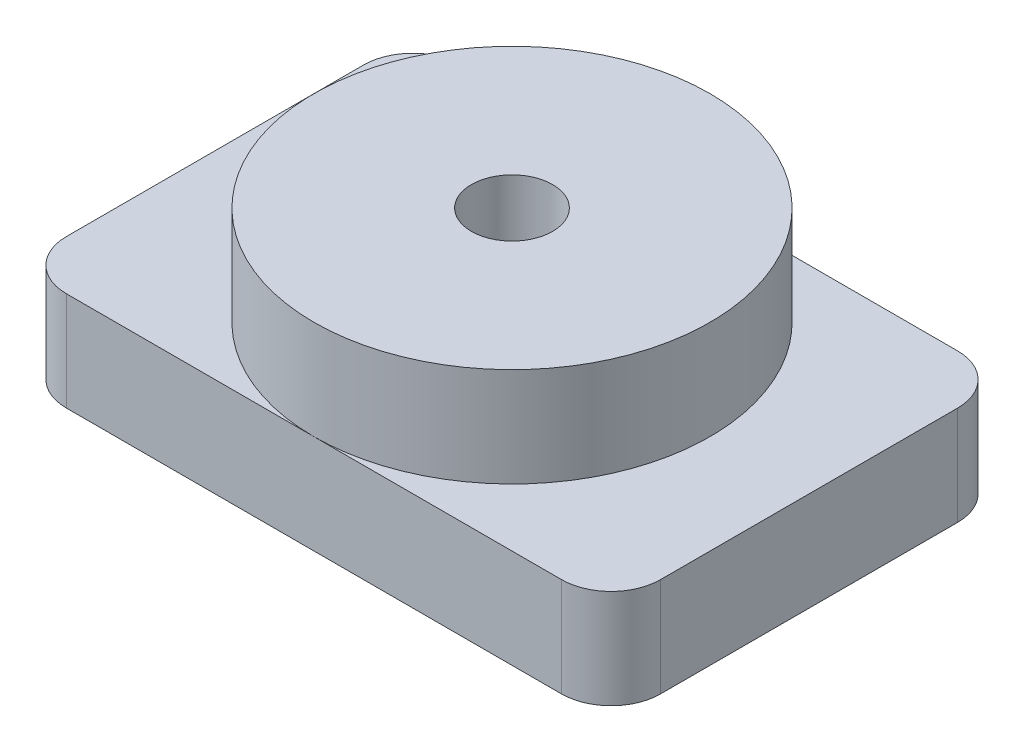
ISO-10303-21;
HEADER;
FILE_DESCRIPTION(('STEP AP214'),'2;1');
FILE_NAME('part.step','',(''),(''),'','','');
FILE_SCHEMA(('AUTOMOTIVE_DESIGN { 1 0 10303 214 1 1 1 1 }'));
ENDSEC;
DATA;
#1=APPLICATION_CONTEXT('core data for automotive mechanical design processes');
#2=APPLICATION_PROTOCOL_DEFINITION('international standard','automotive_design',2000,#1);
#3=PRODUCT_CONTEXT('',#1,'mechanical');
#4=PRODUCT('Part','Part','',(#3));
#5=PRODUCT_RELATED_PRODUCT_CATEGORY('part','',(#4));
#6=PRODUCT_DEFINITION_FORMATION('','',#4);
#7=PRODUCT_DEFINITION_CONTEXT('part definition',#1,'design');
#8=PRODUCT_DEFINITION('design','',#6,#7);
#9=PRODUCT_DEFINITION_SHAPE('','',#8);
#10=(LENGTH_UNIT() NAMED_UNIT(*) SI_UNIT(.MILLI.,.METRE.));
#11=(NAMED_UNIT(*) PLANE_ANGLE_UNIT() SI_UNIT($,.RADIAN.));
#12=(NAMED_UNIT(*) SI_UNIT($,.STERADIAN.) SOLID_ANGLE_UNIT());
#13=UNCERTAINTY_MEASURE_WITH_UNIT(LENGTH_MEASURE(1.E-05),#10,'distance_accuracy_value','');
#14=(GEOMETRIC_REPRESENTATION_CONTEXT(3) GLOBAL_UNCERTAINTY_ASSIGNED_CONTEXT((#13)) GLOBAL_UNIT_ASSIGNED_CONTEXT((#10,
#11,#12)) REPRESENTATION_CONTEXT('',''));
#15=CARTESIAN_POINT('',(0.,0.,0.));
#16=DIRECTION('',(0.,0.,1.));
#17=DIRECTION('',(1.,0.,0.));
#18=AXIS2_PLACEMENT_3D('',#15,#16,#17);
#19=CARTESIAN_POINT('',(0.,0.,0.));
#20=DIRECTION('',(0.,1.,0.));
#21=DIRECTION('',(0.,0.,1.));
#22=AXIS2_PLACEMENT_3D('',#19,#20,#21);
#23=CYLINDRICAL_SURFACE('',#22,4.1);
#24=CARTESIAN_POINT('',(0.,20.,0.));
#25=DIRECTION('',(0.,1.,0.));
#26=DIRECTION('',(0.,0.,1.));
#27=AXIS2_PLACEMENT_3D('',#24,#25,#26);
#28=CIRCLE('',#27,4.1);
#29=CARTESIAN_POINT('',(0.,20.,4.1));
#30=VERTEX_POINT('',#29);
#31=EDGE_CURVE('E197',#30,#30,#28,.T.);
#32=ORIENTED_EDGE('',*,*,#31,.T.);
#33=EDGE_LOOP('',(#32));
#34=FACE_BOUND('',#33,.T.);
#35=CARTESIAN_POINT('',(0.,7.,0.));
#36=DIRECTION('',(0.,-1.,0.));
#37=DIRECTION('',(0.,0.,-1.));
#38=AXIS2_PLACEMENT_3D('',#35,#36,#37);
#39=CIRCLE('',#38,4.1);
#40=CARTESIAN_POINT('',(0.,7.,-4.1));
#41=VERTEX_POINT('',#40);
#42=EDGE_CURVE('E37',#41,#41,#39,.F.);
#43=ORIENTED_EDGE('',*,*,#42,.F.);
#44=EDGE_LOOP('',(#43));
#45=FACE_BOUND('',#44,.T.);
#46=ADVANCED_FACE('F33',(#34,#45),#23,.F.);
#47=CARTESIAN_POINT('',(0.,10.,0.));
#48=DIRECTION('',(0.,-1.,0.));
#49=DIRECTION('',(0.,0.,-1.));
#50=AXIS2_PLACEMENT_3D('',#47,#48,#49);
#51=PLANE('',#50);
#52=DIRECTION('',(0.,0.,-1.));
#53=VECTOR('',#52,1.);
#54=CARTESIAN_POINT('',(30.,10.,-20.));
#55=LINE('',#54,#53);
#56=CARTESIAN_POINT('',(30.,10.,15.));
#57=VERTEX_POINT('',#56);
#58=CARTESIAN_POINT('',(30.,10.,-15.));
#59=VERTEX_POINT('',#58);
#60=EDGE_CURVE('E215',#57,#59,#55,.T.);
#61=ORIENTED_EDGE('',*,*,#60,.T.);
#62=CARTESIAN_POINT('',(25.,10.,-15.));
#63=DIRECTION('',(0.,-1.,0.));
#64=DIRECTION('',(0.,0.,-1.));
#65=AXIS2_PLACEMENT_3D('',#62,#63,#64);
#66=CIRCLE('',#65,5.);
#67=CARTESIAN_POINT('',(25.,10.,-20.));
#68=VERTEX_POINT('',#67);
#69=EDGE_CURVE('E11',#59,#68,#66,.F.);
#70=ORIENTED_EDGE('',*,*,#69,.T.);
#71=DIRECTION('',(-1.,0.,0.));
#72=VECTOR('',#71,1.);
#73=CARTESIAN_POINT('',(30.,10.,-20.));
#74=LINE('',#73,#72);
#75=CARTESIAN_POINT('',(0.,10.,-20.));
#76=VERTEX_POINT('',#75);
#77=EDGE_CURVE('E218',#68,#76,#74,.T.);
#78=ORIENTED_EDGE('',*,*,#77,.T.);
#79=CARTESIAN_POINT('',(0.,10.,0.));
#80=DIRECTION('',(0.,1.,0.));
#81=DIRECTION('',(0.,0.,1.));
#82=AXIS2_PLACEMENT_3D('',#79,#80,#81);
#83=CIRCLE('',#82,20.);
#84=CARTESIAN_POINT('',(0.,10.,20.));
#85=VERTEX_POINT('',#84);
#86=EDGE_CURVE('E200',#85,#76,#83,.T.);
#87=ORIENTED_EDGE('',*,*,#86,.F.);
#88=DIRECTION('',(1.,0.,0.));
#89=VECTOR('',#88,1.);
#90=CARTESIAN_POINT('',(30.,10.,20.));
#91=LINE('',#90,#89);
#92=CARTESIAN_POINT('',(25.,10.,20.));
#93=VERTEX_POINT('',#92);
#94=EDGE_CURVE('E211',#85,#93,#91,.T.);
#95=ORIENTED_EDGE('',*,*,#94,.T.);
#96=CARTESIAN_POINT('',(25.,10.,15.));
#97=DIRECTION('',(0.,-1.,0.));
#98=DIRECTION('',(0.,0.,-1.));
#99=AXIS2_PLACEMENT_3D('',#96,#97,#98);
#100=CIRCLE('',#99,5.);
#101=EDGE_CURVE('E42',#93,#57,#100,.F.);
#102=ORIENTED_EDGE('',*,*,#101,.T.);
#103=EDGE_LOOP('',(#61,#70,#78,#87,#95,#102));
#104=FACE_BOUND('',#103,.T.);
#105=ADVANCED_FACE('F263',(#104),#51,.F.);
#106=CARTESIAN_POINT('',(-30.,10.,-20.));
#107=DIRECTION('',(1.,0.,0.));
#108=DIRECTION('',(0.,0.,-1.));
#109=AXIS2_PLACEMENT_3D('',#106,#107,#108);
#110=PLANE('',#109);
#111=DIRECTION('',(0.,0.,1.));
#112=VECTOR('',#111,1.);
#113=CARTESIAN_POINT('',(-30.,0.,-20.));
#114=LINE('',#113,#112);
#115=CARTESIAN_POINT('',(-30.,0.,-15.));
#116=VERTEX_POINT('',#115);
#117=CARTESIAN_POINT('',(-30.,0.,15.));
#118=VERTEX_POINT('',#117);
#119=EDGE_CURVE('E204',#116,#118,#114,.T.);
#120=ORIENTED_EDGE('',*,*,#119,.T.);
#121=DIRECTION('',(0.,-1.,0.));
#122=VECTOR('',#121,1.);
#123=CARTESIAN_POINT('',(-30.,10.,15.));
#124=LINE('',#123,#122);
#125=CARTESIAN_POINT('',(-30.,10.,15.));
#126=VERTEX_POINT('',#125);
#127=EDGE_CURVE('E245',#118,#126,#124,.F.);
#128=ORIENTED_EDGE('',*,*,#127,.T.);
#129=DIRECTION('',(0.,0.,1.));
#130=VECTOR('',#129,1.);
#131=CARTESIAN_POINT('',(-30.,10.,-20.));
#132=LINE('',#131,#130);
#133=CARTESIAN_POINT('',(-30.,10.,-15.));
#134=VERTEX_POINT('',#133);
#135=EDGE_CURVE('E208',#134,#126,#132,.T.);
#136=ORIENTED_EDGE('',*,*,#135,.F.);
#137=DIRECTION('',(0.,-1.,0.));
#138=VECTOR('',#137,1.);
#139=CARTESIAN_POINT('',(-30.,10.,-15.));
#140=LINE('',#139,#138);
#141=EDGE_CURVE('E242',#134,#116,#140,.T.);
#142=ORIENTED_EDGE('',*,*,#141,.T.);
#143=EDGE_LOOP('',(#120,#128,#136,#142));
#144=FACE_BOUND('',#143,.T.);
#145=ADVANCED_FACE('F285',(#144),#110,.F.);
#146=CARTESIAN_POINT('',(30.,10.,20.));
#147=DIRECTION('',(0.,0.,-1.));
#148=DIRECTION('',(-1.,0.,0.));
#149=AXIS2_PLACEMENT_3D('',#146,#147,#148);
#150=PLANE('',#149);
#151=CARTESIAN_POINT('',(-25.,10.,20.));
#152=VERTEX_POINT('',#151);
#153=EDGE_CURVE('E213',#152,#85,#91,.T.);
#154=ORIENTED_EDGE('',*,*,#153,.F.);
#155=DIRECTION('',(0.,-1.,0.));
#156=VECTOR('',#155,1.);
#157=CARTESIAN_POINT('',(-25.,10.,20.));
#158=LINE('',#157,#156);
#159=CARTESIAN_POINT('',(-25.,0.,20.));
#160=VERTEX_POINT('',#159);
#161=EDGE_CURVE('E231',#152,#160,#158,.T.);
#162=ORIENTED_EDGE('',*,*,#161,.T.);
#163=DIRECTION('',(1.,0.,0.));
#164=VECTOR('',#163,1.);
#165=CARTESIAN_POINT('',(30.,0.,20.));
#166=LINE('',#165,#164);
#167=CARTESIAN_POINT('',(25.,0.,20.));
#168=VERTEX_POINT('',#167);
#169=EDGE_CURVE('E222',#160,#168,#166,.T.);
#170=ORIENTED_EDGE('',*,*,#169,.T.);
#171=DIRECTION('',(0.,-1.,0.));
#172=VECTOR('',#171,1.);
#173=CARTESIAN_POINT('',(25.,10.,20.));
#174=LINE('',#173,#172);
#175=EDGE_CURVE('E229',#168,#93,#174,.F.);
#176=ORIENTED_EDGE('',*,*,#175,.T.);
#177=ORIENTED_EDGE('',*,*,#94,.F.);
#178=EDGE_LOOP('',(#154,#162,#170,#176,#177));
#179=FACE_BOUND('',#178,.T.);
#180=ADVANCED_FACE('F277',(#179),#150,.F.);
#181=CARTESIAN_POINT('',(30.,10.,-20.));
#182=DIRECTION('',(-1.,0.,0.));
#183=DIRECTION('',(0.,0.,1.));
#184=AXIS2_PLACEMENT_3D('',#181,#182,#183);
#185=PLANE('',#184);
#186=DIRECTION('',(0.,0.,-1.));
#187=VECTOR('',#186,1.);
#188=CARTESIAN_POINT('',(30.,0.,-20.));
#189=LINE('',#188,#187);
#190=CARTESIAN_POINT('',(30.,0.,15.));
#191=VERTEX_POINT('',#190);
#192=CARTESIAN_POINT('',(30.,0.,-15.));
#193=VERTEX_POINT('',#192);
#194=EDGE_CURVE('E225',#191,#193,#189,.T.);
#195=ORIENTED_EDGE('',*,*,#194,.T.);
#196=DIRECTION('',(0.,-1.,0.));
#197=VECTOR('',#196,1.);
#198=CARTESIAN_POINT('',(30.,10.,-15.));
#199=LINE('',#198,#197);
#200=EDGE_CURVE('E57',#193,#59,#199,.F.);
#201=ORIENTED_EDGE('',*,*,#200,.T.);
#202=ORIENTED_EDGE('',*,*,#60,.F.);
#203=DIRECTION('',(0.,-1.,0.));
#204=VECTOR('',#203,1.);
#205=CARTESIAN_POINT('',(30.,10.,15.));
#206=LINE('',#205,#204);
#207=EDGE_CURVE('E256',#57,#191,#206,.T.);
#208=ORIENTED_EDGE('',*,*,#207,.T.);
#209=EDGE_LOOP('',(#195,#201,#202,#208));
#210=FACE_BOUND('',#209,.T.);
#211=ADVANCED_FACE('F270',(#210),#185,.F.);
#212=CARTESIAN_POINT('',(30.,10.,-20.));
#213=DIRECTION('',(0.,0.,1.));
#214=DIRECTION('',(1.,0.,0.));
#215=AXIS2_PLACEMENT_3D('',#212,#213,#214);
#216=PLANE('',#215);
#217=DIRECTION('',(-1.,0.,0.));
#218=VECTOR('',#217,1.);
#219=CARTESIAN_POINT('',(30.,0.,-20.));
#220=LINE('',#219,#218);
#221=CARTESIAN_POINT('',(25.,0.,-20.));
#222=VERTEX_POINT('',#221);
#223=CARTESIAN_POINT('',(-25.,0.,-20.));
#224=VERTEX_POINT('',#223);
#225=EDGE_CURVE('E212',#222,#224,#220,.T.);
#226=ORIENTED_EDGE('',*,*,#225,.T.);
#227=DIRECTION('',(0.,-1.,0.));
#228=VECTOR('',#227,1.);
#229=CARTESIAN_POINT('',(-25.,10.,-20.));
#230=LINE('',#229,#228);
#231=CARTESIAN_POINT('',(-25.,10.,-20.));
#232=VERTEX_POINT('',#231);
#233=EDGE_CURVE('E254',#224,#232,#230,.F.);
#234=ORIENTED_EDGE('',*,*,#233,.T.);
#235=EDGE_CURVE('E217',#76,#232,#74,.T.);
#236=ORIENTED_EDGE('',*,*,#235,.F.);
#237=ORIENTED_EDGE('',*,*,#77,.F.);
#238=DIRECTION('',(0.,-1.,0.));
#239=VECTOR('',#238,1.);
#240=CARTESIAN_POINT('',(25.,10.,-20.));
#241=LINE('',#240,#239);
#242=EDGE_CURVE('E251',#68,#222,#241,.T.);
#243=ORIENTED_EDGE('',*,*,#242,.T.);
#244=EDGE_LOOP('',(#226,#234,#236,#237,#243));
#245=FACE_BOUND('',#244,.T.);
#246=ADVANCED_FACE('F294',(#245),#216,.F.);
#247=ORIENTED_EDGE('',*,*,#135,.T.);
#248=CARTESIAN_POINT('',(-25.,10.,15.));
#249=DIRECTION('',(0.,-1.,0.));
#250=DIRECTION('',(0.,0.,-1.));
#251=AXIS2_PLACEMENT_3D('',#248,#249,#250);
#252=CIRCLE('',#251,5.);
#253=EDGE_CURVE('E249',#126,#152,#252,.F.);
#254=ORIENTED_EDGE('',*,*,#253,.T.);
#255=ORIENTED_EDGE('',*,*,#153,.T.);
#256=EDGE_CURVE('E207',#76,#85,#83,.T.);
#257=ORIENTED_EDGE('',*,*,#256,.F.);
#258=ORIENTED_EDGE('',*,*,#235,.T.);
#259=CARTESIAN_POINT('',(-25.,10.,-15.));
#260=DIRECTION('',(0.,-1.,0.));
#261=DIRECTION('',(0.,0.,-1.));
#262=AXIS2_PLACEMENT_3D('',#259,#260,#261);
#263=CIRCLE('',#262,5.);
#264=EDGE_CURVE('E247',#232,#134,#263,.F.);
#265=ORIENTED_EDGE('',*,*,#264,.T.);
#266=EDGE_LOOP('',(#247,#254,#255,#257,#258,#265));
#267=FACE_BOUND('',#266,.T.);
#268=ADVANCED_FACE('F304',(#267),#51,.F.);
#269=CARTESIAN_POINT('',(0.,0.,0.));
#270=DIRECTION('',(0.,-1.,0.));
#271=DIRECTION('',(0.,0.,-1.));
#272=AXIS2_PLACEMENT_3D('',#269,#270,#271);
#273=PLANE('',#272);
#274=DIRECTION('',(-0.5,0.,-0.866025403784439));
#275=VECTOR('',#274,1.);
#276=CARTESIAN_POINT('',(-3.83937929011101,0.,6.65));
#277=LINE('',#276,#275);
#278=CARTESIAN_POINT('',(-3.83937929011101,0.,6.65));
#279=VERTEX_POINT('',#278);
#280=CARTESIAN_POINT('',(-7.67875858022202,0.,0.));
#281=VERTEX_POINT('',#280);
#282=EDGE_CURVE('E49',#279,#281,#277,.T.);
#283=ORIENTED_EDGE('',*,*,#282,.F.);
#284=DIRECTION('',(-1.,0.,0.));
#285=VECTOR('',#284,1.);
#286=CARTESIAN_POINT('',(3.83937929011101,0.,6.65));
#287=LINE('',#286,#285);
#288=CARTESIAN_POINT('',(3.83937929011101,0.,6.65));
#289=VERTEX_POINT('',#288);
#290=EDGE_CURVE('E164',#289,#279,#287,.T.);
#291=ORIENTED_EDGE('',*,*,#290,.F.);
#292=DIRECTION('',(-0.5,0.,0.866025403784439));
#293=VECTOR('',#292,1.);
#294=CARTESIAN_POINT('',(7.67875858022202,0.,0.));
#295=LINE('',#294,#293);
#296=CARTESIAN_POINT('',(7.67875858022202,0.,0.));
#297=VERTEX_POINT('',#296);
#298=EDGE_CURVE('E167',#297,#289,#295,.T.);
#299=ORIENTED_EDGE('',*,*,#298,.F.);
#300=DIRECTION('',(0.5,0.,0.866025403784439));
#301=VECTOR('',#300,1.);
#302=CARTESIAN_POINT('',(3.83937929011101,0.,-6.65));
#303=LINE('',#302,#301);
#304=CARTESIAN_POINT('',(3.83937929011101,0.,-6.65));
#305=VERTEX_POINT('',#304);
#306=EDGE_CURVE('E183',#305,#297,#303,.T.);
#307=ORIENTED_EDGE('',*,*,#306,.F.);
#308=DIRECTION('',(1.,0.,0.));
#309=VECTOR('',#308,1.);
#310=CARTESIAN_POINT('',(-3.83937929011101,0.,-6.65));
#311=LINE('',#310,#309);
#312=CARTESIAN_POINT('',(-3.83937929011101,0.,-6.65));
#313=VERTEX_POINT('',#312);
#314=EDGE_CURVE('E180',#313,#305,#311,.T.);
#315=ORIENTED_EDGE('',*,*,#314,.F.);
#316=DIRECTION('',(0.5,0.,-0.866025403784438));
#317=VECTOR('',#316,1.);
#318=CARTESIAN_POINT('',(-7.67875858022202,0.,0.));
#319=LINE('',#318,#317);
#320=EDGE_CURVE('E178',#281,#313,#319,.T.);
#321=ORIENTED_EDGE('',*,*,#320,.F.);
#322=EDGE_LOOP('',(#283,#291,#299,#307,#315,#321));
#323=FACE_BOUND('',#322,.T.);
#324=ORIENTED_EDGE('',*,*,#169,.F.);
#325=CARTESIAN_POINT('',(-25.,0.,15.));
#326=DIRECTION('',(0.,-1.,0.));
#327=DIRECTION('',(0.,0.,-1.));
#328=AXIS2_PLACEMENT_3D('',#325,#326,#327);
#329=CIRCLE('',#328,5.);
#330=EDGE_CURVE('E240',#160,#118,#329,.T.);
#331=ORIENTED_EDGE('',*,*,#330,.T.);
#332=ORIENTED_EDGE('',*,*,#119,.F.);
#333=CARTESIAN_POINT('',(-25.,0.,-15.));
#334=DIRECTION('',(0.,-1.,0.));
#335=DIRECTION('',(0.,0.,-1.));
#336=AXIS2_PLACEMENT_3D('',#333,#334,#335);
#337=CIRCLE('',#336,5.);
#338=EDGE_CURVE('E238',#116,#224,#337,.T.);
#339=ORIENTED_EDGE('',*,*,#338,.T.);
#340=ORIENTED_EDGE('',*,*,#225,.F.);
#341=CARTESIAN_POINT('',(25.,0.,-15.));
#342=DIRECTION('',(0.,-1.,0.));
#343=DIRECTION('',(0.,0.,-1.));
#344=AXIS2_PLACEMENT_3D('',#341,#342,#343);
#345=CIRCLE('',#344,5.);
#346=EDGE_CURVE('E236',#222,#193,#345,.T.);
#347=ORIENTED_EDGE('',*,*,#346,.T.);
#348=ORIENTED_EDGE('',*,*,#194,.F.);
#349=CARTESIAN_POINT('',(25.,0.,15.));
#350=DIRECTION('',(0.,-1.,0.));
#351=DIRECTION('',(0.,0.,-1.));
#352=AXIS2_PLACEMENT_3D('',#349,#350,#351);
#353=CIRCLE('',#352,5.);
#354=EDGE_CURVE('E234',#191,#168,#353,.T.);
#355=ORIENTED_EDGE('',*,*,#354,.T.);
#356=EDGE_LOOP('',(#324,#331,#332,#339,#340,#347,#348,#355));
#357=FACE_BOUND('',#356,.T.);
#358=ADVANCED_FACE('F274',(#323,#357),#273,.T.);
#359=CARTESIAN_POINT('',(0.,20.,0.));
#360=DIRECTION('',(0.,-1.,0.));
#361=DIRECTION('',(0.,0.,-1.));
#362=AXIS2_PLACEMENT_3D('',#359,#360,#361);
#363=CYLINDRICAL_SURFACE('',#362,20.);
#364=CARTESIAN_POINT('',(0.,20.,0.));
#365=DIRECTION('',(0.,1.,0.));
#366=DIRECTION('',(0.,0.,1.));
#367=AXIS2_PLACEMENT_3D('',#364,#365,#366);
#368=CIRCLE('',#367,20.);
#369=CARTESIAN_POINT('',(0.,20.,20.));
#370=VERTEX_POINT('',#369);
#371=EDGE_CURVE('E201',#370,#370,#368,.T.);
#372=ORIENTED_EDGE('',*,*,#371,.F.);
#373=EDGE_LOOP('',(#372));
#374=FACE_BOUND('',#373,.T.);
#375=ORIENTED_EDGE('',*,*,#86,.T.);
#376=ORIENTED_EDGE('',*,*,#256,.T.);
#377=EDGE_LOOP('',(#375,#376));
#378=FACE_BOUND('',#377,.T.);
#379=ADVANCED_FACE('F306',(#374,#378),#363,.T.);
#380=CARTESIAN_POINT('',(0.,20.,0.));
#381=DIRECTION('',(0.,1.,0.));
#382=DIRECTION('',(0.,0.,1.));
#383=AXIS2_PLACEMENT_3D('',#380,#381,#382);
#384=PLANE('',#383);
#385=ORIENTED_EDGE('',*,*,#31,.F.);
#386=EDGE_LOOP('',(#385));
#387=FACE_BOUND('',#386,.T.);
#388=ORIENTED_EDGE('',*,*,#371,.T.);
#389=EDGE_LOOP('',(#388));
#390=FACE_BOUND('',#389,.T.);
#391=ADVANCED_FACE('F308',(#387,#390),#384,.T.);
#392=CARTESIAN_POINT('',(-25.,10.,15.));
#393=DIRECTION('',(0.,-1.,0.));
#394=DIRECTION('',(0.,0.,-1.));
#395=AXIS2_PLACEMENT_3D('',#392,#393,#394);
#396=CYLINDRICAL_SURFACE('',#395,5.);
#397=ORIENTED_EDGE('',*,*,#253,.F.);
#398=ORIENTED_EDGE('',*,*,#127,.F.);
#399=ORIENTED_EDGE('',*,*,#330,.F.);
#400=ORIENTED_EDGE('',*,*,#161,.F.);
#401=EDGE_LOOP('',(#397,#398,#399,#400));
#402=FACE_BOUND('',#401,.T.);
#403=ADVANCED_FACE('F281',(#402),#396,.T.);
#404=CARTESIAN_POINT('',(-25.,10.,-15.));
#405=DIRECTION('',(0.,-1.,0.));
#406=DIRECTION('',(0.,0.,-1.));
#407=AXIS2_PLACEMENT_3D('',#404,#405,#406);
#408=CYLINDRICAL_SURFACE('',#407,5.);
#409=ORIENTED_EDGE('',*,*,#264,.F.);
#410=ORIENTED_EDGE('',*,*,#233,.F.);
#411=ORIENTED_EDGE('',*,*,#338,.F.);
#412=ORIENTED_EDGE('',*,*,#141,.F.);
#413=EDGE_LOOP('',(#409,#410,#411,#412));
#414=FACE_BOUND('',#413,.T.);
#415=ADVANCED_FACE('F290',(#414),#408,.T.);
#416=CARTESIAN_POINT('',(25.,10.,-15.));
#417=DIRECTION('',(0.,-1.,0.));
#418=DIRECTION('',(0.,0.,-1.));
#419=AXIS2_PLACEMENT_3D('',#416,#417,#418);
#420=CYLINDRICAL_SURFACE('',#419,5.);
#421=ORIENTED_EDGE('',*,*,#69,.F.);
#422=ORIENTED_EDGE('',*,*,#200,.F.);
#423=ORIENTED_EDGE('',*,*,#346,.F.);
#424=ORIENTED_EDGE('',*,*,#242,.F.);
#425=EDGE_LOOP('',(#421,#422,#423,#424));
#426=FACE_BOUND('',#425,.T.);
#427=ADVANCED_FACE('F300',(#426),#420,.T.);
#428=CARTESIAN_POINT('',(25.,10.,15.));
#429=DIRECTION('',(0.,-1.,0.));
#430=DIRECTION('',(0.,0.,-1.));
#431=AXIS2_PLACEMENT_3D('',#428,#429,#430);
#432=CYLINDRICAL_SURFACE('',#431,5.);
#433=ORIENTED_EDGE('',*,*,#101,.F.);
#434=ORIENTED_EDGE('',*,*,#175,.F.);
#435=ORIENTED_EDGE('',*,*,#354,.F.);
#436=ORIENTED_EDGE('',*,*,#207,.F.);
#437=EDGE_LOOP('',(#433,#434,#435,#436));
#438=FACE_BOUND('',#437,.T.);
#439=ADVANCED_FACE('F35',(#438),#432,.T.);
#440=CARTESIAN_POINT('',(0.,7.,0.));
#441=DIRECTION('',(0.,-1.,0.));
#442=DIRECTION('',(0.,0.,-1.));
#443=AXIS2_PLACEMENT_3D('',#440,#441,#442);
#444=PLANE('',#443);
#445=DIRECTION('',(-0.5,0.,-0.866025403784439));
#446=VECTOR('',#445,1.);
#447=CARTESIAN_POINT('',(-3.83937929011101,7.,6.65));
#448=LINE('',#447,#446);
#449=CARTESIAN_POINT('',(-3.83937929011101,7.,6.65));
#450=VERTEX_POINT('',#449);
#451=CARTESIAN_POINT('',(-7.67875858022202,7.,0.));
#452=VERTEX_POINT('',#451);
#453=EDGE_CURVE('E144',#450,#452,#448,.T.);
#454=ORIENTED_EDGE('',*,*,#453,.T.);
#455=DIRECTION('',(0.5,0.,-0.866025403784438));
#456=VECTOR('',#455,1.);
#457=CARTESIAN_POINT('',(-7.67875858022202,7.,0.));
#458=LINE('',#457,#456);
#459=CARTESIAN_POINT('',(-3.83937929011101,7.,-6.65));
#460=VERTEX_POINT('',#459);
#461=EDGE_CURVE('E153',#452,#460,#458,.T.);
#462=ORIENTED_EDGE('',*,*,#461,.T.);
#463=DIRECTION('',(1.,0.,0.));
#464=VECTOR('',#463,1.);
#465=CARTESIAN_POINT('',(-3.83937929011101,7.,-6.65));
#466=LINE('',#465,#464);
#467=CARTESIAN_POINT('',(3.83937929011101,7.,-6.65));
#468=VERTEX_POINT('',#467);
#469=EDGE_CURVE('E158',#460,#468,#466,.T.);
#470=ORIENTED_EDGE('',*,*,#469,.T.);
#471=DIRECTION('',(0.5,0.,0.866025403784439));
#472=VECTOR('',#471,1.);
#473=CARTESIAN_POINT('',(3.83937929011101,7.,-6.65));
#474=LINE('',#473,#472);
#475=CARTESIAN_POINT('',(7.67875858022202,7.,0.));
#476=VERTEX_POINT('',#475);
#477=EDGE_CURVE('E171',#468,#476,#474,.T.);
#478=ORIENTED_EDGE('',*,*,#477,.T.);
#479=DIRECTION('',(-0.5,0.,0.866025403784439));
#480=VECTOR('',#479,1.);
#481=CARTESIAN_POINT('',(7.67875858022202,7.,0.));
#482=LINE('',#481,#480);
#483=CARTESIAN_POINT('',(3.83937929011101,7.,6.65));
#484=VERTEX_POINT('',#483);
#485=EDGE_CURVE('E174',#476,#484,#482,.T.);
#486=ORIENTED_EDGE('',*,*,#485,.T.);
#487=DIRECTION('',(-1.,0.,0.));
#488=VECTOR('',#487,1.);
#489=CARTESIAN_POINT('',(3.83937929011101,7.,6.65));
#490=LINE('',#489,#488);
#491=EDGE_CURVE('E150',#484,#450,#490,.T.);
#492=ORIENTED_EDGE('',*,*,#491,.T.);
#493=EDGE_LOOP('',(#454,#462,#470,#478,#486,#492));
#494=FACE_BOUND('',#493,.T.);
#495=ORIENTED_EDGE('',*,*,#42,.T.);
#496=EDGE_LOOP('',(#495));
#497=FACE_BOUND('',#496,.T.);
#498=ADVANCED_FACE('F160',(#494,#497),#444,.T.);
#499=CARTESIAN_POINT('',(-3.83937929011101,7.,6.65));
#500=DIRECTION('',(-0.866025403784439,0.,0.5));
#501=DIRECTION('',(0.5,0.,0.866025403784439));
#502=AXIS2_PLACEMENT_3D('',#499,#500,#501);
#503=PLANE('',#502);
#504=ORIENTED_EDGE('',*,*,#282,.T.);
#505=DIRECTION('',(0.,-1.,0.));
#506=VECTOR('',#505,1.);
#507=CARTESIAN_POINT('',(-7.67875858022202,7.,0.));
#508=LINE('',#507,#506);
#509=EDGE_CURVE('E140',#452,#281,#508,.T.);
#510=ORIENTED_EDGE('',*,*,#509,.F.);
#511=ORIENTED_EDGE('',*,*,#453,.F.);
#512=DIRECTION('',(0.,-1.,0.));
#513=VECTOR('',#512,1.);
#514=CARTESIAN_POINT('',(-3.83937929011101,7.,6.65));
#515=LINE('',#514,#513);
#516=EDGE_CURVE('E188',#450,#279,#515,.T.);
#517=ORIENTED_EDGE('',*,*,#516,.T.);
#518=EDGE_LOOP('',(#504,#510,#511,#517));
#519=FACE_BOUND('',#518,.T.);
#520=ADVANCED_FACE('F142',(#519),#503,.F.);
#521=CARTESIAN_POINT('',(3.83937929011101,7.,6.65));
#522=DIRECTION('',(0.,0.,1.));
#523=DIRECTION('',(1.,0.,0.));
#524=AXIS2_PLACEMENT_3D('',#521,#522,#523);
#525=PLANE('',#524);
#526=ORIENTED_EDGE('',*,*,#290,.T.);
#527=ORIENTED_EDGE('',*,*,#516,.F.);
#528=ORIENTED_EDGE('',*,*,#491,.F.);
#529=DIRECTION('',(0.,-1.,0.));
#530=VECTOR('',#529,1.);
#531=CARTESIAN_POINT('',(3.83937929011101,7.,6.65));
#532=LINE('',#531,#530);
#533=EDGE_CURVE('E190',#484,#289,#532,.T.);
#534=ORIENTED_EDGE('',*,*,#533,.T.);
#535=EDGE_LOOP('',(#526,#527,#528,#534));
#536=FACE_BOUND('',#535,.T.);
#537=ADVANCED_FACE('F333',(#536),#525,.F.);
#538=CARTESIAN_POINT('',(7.67875858022202,7.,0.));
#539=DIRECTION('',(0.866025403784439,0.,0.5));
#540=DIRECTION('',(0.5,0.,-0.866025403784439));
#541=AXIS2_PLACEMENT_3D('',#538,#539,#540);
#542=PLANE('',#541);
#543=ORIENTED_EDGE('',*,*,#298,.T.);
#544=ORIENTED_EDGE('',*,*,#533,.F.);
#545=ORIENTED_EDGE('',*,*,#485,.F.);
#546=DIRECTION('',(0.,-1.,0.));
#547=VECTOR('',#546,1.);
#548=CARTESIAN_POINT('',(7.67875858022202,7.,0.));
#549=LINE('',#548,#547);
#550=EDGE_CURVE('E192',#476,#297,#549,.T.);
#551=ORIENTED_EDGE('',*,*,#550,.T.);
#552=EDGE_LOOP('',(#543,#544,#545,#551));
#553=FACE_BOUND('',#552,.T.);
#554=ADVANCED_FACE('F343',(#553),#542,.F.);
#555=CARTESIAN_POINT('',(3.83937929011101,7.,-6.65));
#556=DIRECTION('',(0.866025403784439,0.,-0.5));
#557=DIRECTION('',(-0.5,0.,-0.866025403784439));
#558=AXIS2_PLACEMENT_3D('',#555,#556,#557);
#559=PLANE('',#558);
#560=ORIENTED_EDGE('',*,*,#306,.T.);
#561=ORIENTED_EDGE('',*,*,#550,.F.);
#562=ORIENTED_EDGE('',*,*,#477,.F.);
#563=DIRECTION('',(0.,-1.,0.));
#564=VECTOR('',#563,1.);
#565=CARTESIAN_POINT('',(3.83937929011101,7.,-6.65));
#566=LINE('',#565,#564);
#567=EDGE_CURVE('E194',#468,#305,#566,.T.);
#568=ORIENTED_EDGE('',*,*,#567,.T.);
#569=EDGE_LOOP('',(#560,#561,#562,#568));
#570=FACE_BOUND('',#569,.T.);
#571=ADVANCED_FACE('F339',(#570),#559,.F.);
#572=CARTESIAN_POINT('',(-3.83937929011101,7.,-6.65));
#573=DIRECTION('',(0.,0.,-1.));
#574=DIRECTION('',(-1.,0.,0.));
#575=AXIS2_PLACEMENT_3D('',#572,#573,#574);
#576=PLANE('',#575);
#577=ORIENTED_EDGE('',*,*,#314,.T.);
#578=ORIENTED_EDGE('',*,*,#567,.F.);
#579=ORIENTED_EDGE('',*,*,#469,.F.);
#580=DIRECTION('',(0.,-1.,0.));
#581=VECTOR('',#580,1.);
#582=CARTESIAN_POINT('',(-3.83937929011101,7.,-6.65));
#583=LINE('',#582,#581);
#584=EDGE_CURVE('E149',#460,#313,#583,.T.);
#585=ORIENTED_EDGE('',*,*,#584,.T.);
#586=EDGE_LOOP('',(#577,#578,#579,#585));
#587=FACE_BOUND('',#586,.T.);
#588=ADVANCED_FACE('F336',(#587),#576,.F.);
#589=CARTESIAN_POINT('',(-7.67875858022202,7.,0.));
#590=DIRECTION('',(-0.866025403784438,0.,-0.5));
#591=DIRECTION('',(-0.5,0.,0.866025403784438));
#592=AXIS2_PLACEMENT_3D('',#589,#590,#591);
#593=PLANE('',#592);
#594=ORIENTED_EDGE('',*,*,#320,.T.);
#595=ORIENTED_EDGE('',*,*,#584,.F.);
#596=ORIENTED_EDGE('',*,*,#461,.F.);
#597=ORIENTED_EDGE('',*,*,#509,.T.);
#598=EDGE_LOOP('',(#594,#595,#596,#597));
#599=FACE_BOUND('',#598,.T.);
#600=ADVANCED_FACE('F154',(#599),#593,.F.);
#601=CLOSED_SHELL('',(#46,#105,#145,#180,#211,#246,#268,#358,#379,#391,#403,#415,#427,#439,#498,
#520,#537,#554,#571,#588,#600));
#602=MANIFOLD_SOLID_BREP('B2',#601);
#603=ADVANCED_BREP_SHAPE_REPRESENTATION('',(#18,#602),#14);
#604=SHAPE_DEFINITION_REPRESENTATION(#9,#603);
ENDSEC;
END-ISO-10303-21;
